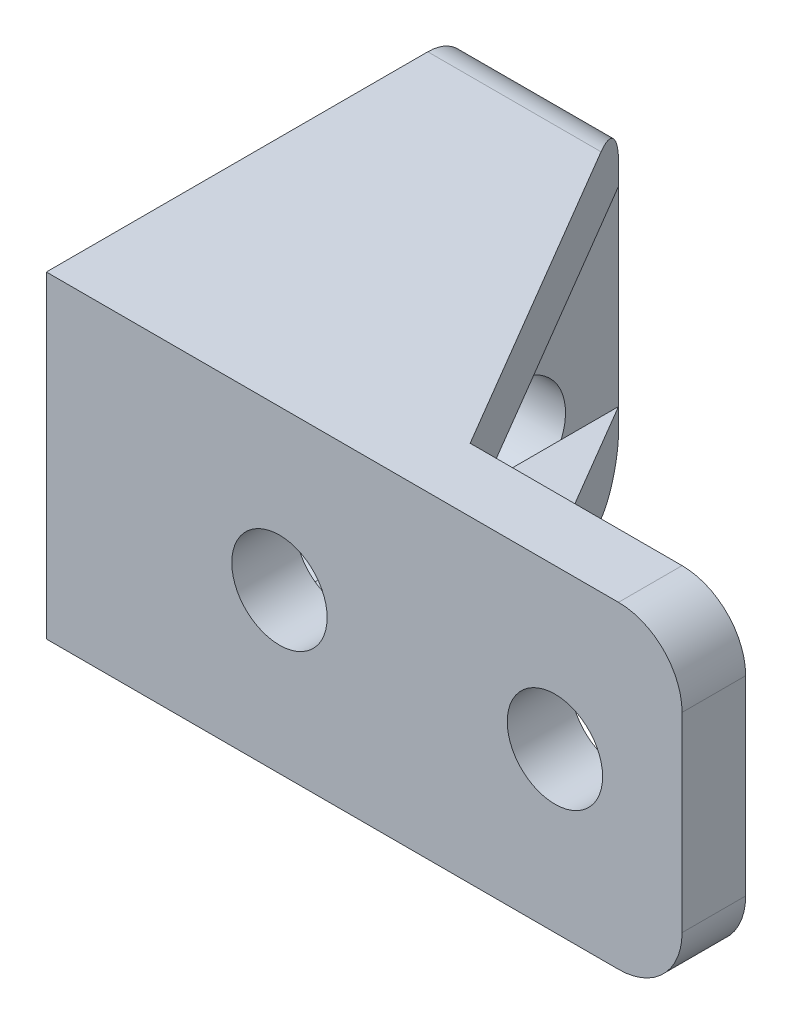
ISO-10303-21;
HEADER;
FILE_DESCRIPTION(('STEP AP214'),'2;1');
FILE_NAME('part.step','',(''),(''),'','','');
FILE_SCHEMA(('AUTOMOTIVE_DESIGN { 1 0 10303 214 1 1 1 1 }'));
ENDSEC;
DATA;
#1=APPLICATION_CONTEXT('core data for automotive mechanical design processes');
#2=APPLICATION_PROTOCOL_DEFINITION('international standard','automotive_design',2000,#1);
#3=PRODUCT_CONTEXT('',#1,'mechanical');
#4=PRODUCT('Part','Part','',(#3));
#5=PRODUCT_RELATED_PRODUCT_CATEGORY('part','',(#4));
#6=PRODUCT_DEFINITION_FORMATION('','',#4);
#7=PRODUCT_DEFINITION_CONTEXT('part definition',#1,'design');
#8=PRODUCT_DEFINITION('design','',#6,#7);
#9=PRODUCT_DEFINITION_SHAPE('','',#8);
#10=(LENGTH_UNIT() NAMED_UNIT(*) SI_UNIT(.MILLI.,.METRE.));
#11=(NAMED_UNIT(*) PLANE_ANGLE_UNIT() SI_UNIT($,.RADIAN.));
#12=(NAMED_UNIT(*) SI_UNIT($,.STERADIAN.) SOLID_ANGLE_UNIT());
#13=UNCERTAINTY_MEASURE_WITH_UNIT(LENGTH_MEASURE(1.E-05),#10,'distance_accuracy_value','');
#14=(GEOMETRIC_REPRESENTATION_CONTEXT(3) GLOBAL_UNCERTAINTY_ASSIGNED_CONTEXT((#13)) GLOBAL_UNIT_ASSIGNED_CONTEXT((#10,
#11,#12)) REPRESENTATION_CONTEXT('',''));
#15=CARTESIAN_POINT('',(0.,0.,0.));
#16=DIRECTION('',(0.,0.,1.));
#17=DIRECTION('',(1.,0.,0.));
#18=AXIS2_PLACEMENT_3D('',#15,#16,#17);
#19=CARTESIAN_POINT('',(0.,15.,-1.5));
#20=DIRECTION('',(0.,0.,1.));
#21=DIRECTION('',(1.,0.,0.));
#22=AXIS2_PLACEMENT_3D('',#19,#20,#21);
#23=PLANE('',#22);
#24=CARTESIAN_POINT('',(9.,7.5,-1.5));
#25=DIRECTION('',(0.,0.,-1.));
#26=DIRECTION('',(-1.,0.,0.));
#27=AXIS2_PLACEMENT_3D('',#24,#25,#26);
#28=CIRCLE('',#27,2.25);
#29=CARTESIAN_POINT('',(6.75,7.5,-1.5));
#30=VERTEX_POINT('',#29);
#31=EDGE_CURVE('E249',#30,#30,#28,.T.);
#32=ORIENTED_EDGE('',*,*,#31,.F.);
#33=EDGE_LOOP('',(#32));
#34=FACE_BOUND('',#33,.T.);
#35=CARTESIAN_POINT('',(-4.,7.5,-1.5));
#36=DIRECTION('',(0.,0.,-1.));
#37=DIRECTION('',(-1.,0.,0.));
#38=AXIS2_PLACEMENT_3D('',#35,#36,#37);
#39=CIRCLE('',#38,2.25);
#40=CARTESIAN_POINT('',(-6.25,7.5,-1.5));
#41=VERTEX_POINT('',#40);
#42=EDGE_CURVE('E245',#41,#41,#39,.T.);
#43=ORIENTED_EDGE('',*,*,#42,.F.);
#44=EDGE_LOOP('',(#43));
#45=FACE_BOUND('',#44,.T.);
#46=DIRECTION('',(-1.,0.,0.));
#47=VECTOR('',#46,1.);
#48=CARTESIAN_POINT('',(0.,15.,-1.5));
#49=LINE('',#48,#47);
#50=CARTESIAN_POINT('',(12.,15.,-1.5));
#51=VERTEX_POINT('',#50);
#52=CARTESIAN_POINT('',(2.,15.,-1.5));
#53=VERTEX_POINT('',#52);
#54=EDGE_CURVE('E355',#51,#53,#49,.T.);
#55=ORIENTED_EDGE('',*,*,#54,.F.);
#56=CARTESIAN_POINT('',(12.,12.,-1.5));
#57=DIRECTION('',(0.,0.,1.));
#58=DIRECTION('',(1.,0.,0.));
#59=AXIS2_PLACEMENT_3D('',#56,#57,#58);
#60=CIRCLE('',#59,3.);
#61=CARTESIAN_POINT('',(15.,12.,-1.5));
#62=VERTEX_POINT('',#61);
#63=EDGE_CURVE('E274',#51,#62,#60,.F.);
#64=ORIENTED_EDGE('',*,*,#63,.T.);
#65=DIRECTION('',(0.,-1.,0.));
#66=VECTOR('',#65,1.);
#67=CARTESIAN_POINT('',(15.,15.,-1.5));
#68=LINE('',#67,#66);
#69=CARTESIAN_POINT('',(15.,3.,-1.5));
#70=VERTEX_POINT('',#69);
#71=EDGE_CURVE('E377',#62,#70,#68,.T.);
#72=ORIENTED_EDGE('',*,*,#71,.T.);
#73=CARTESIAN_POINT('',(12.,3.,-1.5));
#74=DIRECTION('',(0.,0.,1.));
#75=DIRECTION('',(1.,0.,0.));
#76=AXIS2_PLACEMENT_3D('',#73,#74,#75);
#77=CIRCLE('',#76,3.);
#78=CARTESIAN_POINT('',(12.,0.,-1.5));
#79=VERTEX_POINT('',#78);
#80=EDGE_CURVE('E271',#70,#79,#77,.F.);
#81=ORIENTED_EDGE('',*,*,#80,.T.);
#82=DIRECTION('',(-1.,0.,0.));
#83=VECTOR('',#82,1.);
#84=CARTESIAN_POINT('',(0.,0.,-1.5));
#85=LINE('',#84,#83);
#86=CARTESIAN_POINT('',(2.00000000000001,0.,-1.5));
#87=VERTEX_POINT('',#86);
#88=EDGE_CURVE('E352',#79,#87,#85,.T.);
#89=ORIENTED_EDGE('',*,*,#88,.T.);
#90=DIRECTION('',(0.,-1.,0.));
#91=VECTOR('',#90,1.);
#92=CARTESIAN_POINT('',(2.00000000000001,3.,-1.5));
#93=LINE('',#92,#91);
#94=CARTESIAN_POINT('',(2.00000000000001,3.,-1.5));
#95=VERTEX_POINT('',#94);
#96=EDGE_CURVE('E200',#95,#87,#93,.T.);
#97=ORIENTED_EDGE('',*,*,#96,.F.);
#98=DIRECTION('',(1.,0.,0.));
#99=VECTOR('',#98,1.);
#100=CARTESIAN_POINT('',(0.,3.,-1.5));
#101=LINE('',#100,#99);
#102=CARTESIAN_POINT('',(-8.,3.,-1.5));
#103=VERTEX_POINT('',#102);
#104=EDGE_CURVE('E197',#103,#95,#101,.T.);
#105=ORIENTED_EDGE('',*,*,#104,.F.);
#106=DIRECTION('',(0.,-1.,0.));
#107=VECTOR('',#106,1.);
#108=CARTESIAN_POINT('',(-8.,15.,-1.5));
#109=LINE('',#108,#107);
#110=CARTESIAN_POINT('',(-8.,5.5,-1.5));
#111=VERTEX_POINT('',#110);
#112=EDGE_CURVE('E211',#111,#103,#109,.T.);
#113=ORIENTED_EDGE('',*,*,#112,.F.);
#114=DIRECTION('',(0.,-1.,0.));
#115=VECTOR('',#114,1.);
#116=CARTESIAN_POINT('',(-8.,15.,-1.5));
#117=LINE('',#116,#115);
#118=CARTESIAN_POINT('',(-8.,9.5,-1.5));
#119=VERTEX_POINT('',#118);
#120=EDGE_CURVE('E373',#119,#111,#117,.T.);
#121=ORIENTED_EDGE('',*,*,#120,.F.);
#122=CARTESIAN_POINT('',(-8.,12.,-1.5));
#123=VERTEX_POINT('',#122);
#124=EDGE_CURVE('E374',#123,#119,#117,.T.);
#125=ORIENTED_EDGE('',*,*,#124,.F.);
#126=DIRECTION('',(1.,0.,0.));
#127=VECTOR('',#126,1.);
#128=CARTESIAN_POINT('',(-8.,12.,-1.5));
#129=LINE('',#128,#127);
#130=CARTESIAN_POINT('',(2.,12.,-1.5));
#131=VERTEX_POINT('',#130);
#132=EDGE_CURVE('E332',#123,#131,#129,.T.);
#133=ORIENTED_EDGE('',*,*,#132,.T.);
#134=DIRECTION('',(0.,1.,0.));
#135=VECTOR('',#134,1.);
#136=CARTESIAN_POINT('',(2.,12.,-1.5));
#137=LINE('',#136,#135);
#138=EDGE_CURVE('E341',#131,#53,#137,.T.);
#139=ORIENTED_EDGE('',*,*,#138,.T.);
#140=EDGE_LOOP('',(#55,#64,#72,#81,#89,#97,#105,#113,#121,#125,#133,#139));
#141=FACE_BOUND('',#140,.T.);
#142=ADVANCED_FACE('F41',(#34,#45,#141),#23,.F.);
#143=CARTESIAN_POINT('',(-8.,15.,0.));
#144=DIRECTION('',(-1.,0.,0.));
#145=DIRECTION('',(0.,0.,1.));
#146=AXIS2_PLACEMENT_3D('',#143,#144,#145);
#147=PLANE('',#146);
#148=ORIENTED_EDGE('',*,*,#120,.T.);
#149=CARTESIAN_POINT('',(-8.,4.,-3.5));
#150=DIRECTION('',(-1.,0.,0.));
#151=DIRECTION('',(0.,0.,1.));
#152=AXIS2_PLACEMENT_3D('',#149,#150,#151);
#153=CIRCLE('',#152,2.5);
#154=CARTESIAN_POINT('',(-8.,3.,-5.79128784747792));
#155=VERTEX_POINT('',#154);
#156=EDGE_CURVE('E225',#155,#111,#153,.F.);
#157=ORIENTED_EDGE('',*,*,#156,.F.);
#158=DIRECTION('',(0.,0.,1.));
#159=VECTOR('',#158,1.);
#160=CARTESIAN_POINT('',(-8.,3.,0.));
#161=LINE('',#160,#159);
#162=CARTESIAN_POINT('',(-8.,3.,-11.2087121525221));
#163=VERTEX_POINT('',#162);
#164=EDGE_CURVE('E171',#163,#155,#161,.T.);
#165=ORIENTED_EDGE('',*,*,#164,.F.);
#166=CARTESIAN_POINT('',(-8.,4.,-13.5));
#167=DIRECTION('',(-1.,0.,0.));
#168=DIRECTION('',(0.,0.,1.));
#169=AXIS2_PLACEMENT_3D('',#166,#167,#168);
#170=CIRCLE('',#169,2.5);
#171=CARTESIAN_POINT('',(-8.,3.,-15.7912878474779));
#172=VERTEX_POINT('',#171);
#173=EDGE_CURVE('E177',#172,#163,#170,.F.);
#174=ORIENTED_EDGE('',*,*,#173,.F.);
#175=CARTESIAN_POINT('',(-8.,3.,-18.5));
#176=VERTEX_POINT('',#175);
#177=EDGE_CURVE('E170',#176,#172,#161,.T.);
#178=ORIENTED_EDGE('',*,*,#177,.F.);
#179=DIRECTION('',(0.,-1.,0.));
#180=VECTOR('',#179,1.);
#181=CARTESIAN_POINT('',(-8.,15.,-18.5));
#182=LINE('',#181,#180);
#183=CARTESIAN_POINT('',(-8.,12.,-18.5));
#184=VERTEX_POINT('',#183);
#185=EDGE_CURVE('E369',#184,#176,#182,.T.);
#186=ORIENTED_EDGE('',*,*,#185,.F.);
#187=DIRECTION('',(0.,0.,1.));
#188=VECTOR('',#187,1.);
#189=CARTESIAN_POINT('',(-8.,12.,-18.5));
#190=LINE('',#189,#188);
#191=CARTESIAN_POINT('',(-8.,12.,-15.7912878474779));
#192=VERTEX_POINT('',#191);
#193=EDGE_CURVE('E328',#184,#192,#190,.T.);
#194=ORIENTED_EDGE('',*,*,#193,.T.);
#195=CARTESIAN_POINT('',(-8.,11.,-13.5));
#196=DIRECTION('',(-1.,0.,0.));
#197=DIRECTION('',(0.,0.,1.));
#198=AXIS2_PLACEMENT_3D('',#195,#196,#197);
#199=CIRCLE('',#198,2.5);
#200=CARTESIAN_POINT('',(-8.,12.,-11.2087121525221));
#201=VERTEX_POINT('',#200);
#202=EDGE_CURVE('E241',#201,#192,#199,.F.);
#203=ORIENTED_EDGE('',*,*,#202,.F.);
#204=CARTESIAN_POINT('',(-8.,12.,-5.79128784747792));
#205=VERTEX_POINT('',#204);
#206=EDGE_CURVE('E674',#201,#205,#190,.T.);
#207=ORIENTED_EDGE('',*,*,#206,.T.);
#208=CARTESIAN_POINT('',(-8.,11.,-3.5));
#209=DIRECTION('',(-1.,0.,0.));
#210=DIRECTION('',(0.,0.,1.));
#211=AXIS2_PLACEMENT_3D('',#208,#209,#210);
#212=CIRCLE('',#211,2.5);
#213=EDGE_CURVE('E216',#119,#205,#212,.F.);
#214=ORIENTED_EDGE('',*,*,#213,.F.);
#215=EDGE_LOOP('',(#148,#157,#165,#174,#178,#186,#194,#203,#207,#214));
#216=FACE_BOUND('',#215,.T.);
#217=ADVANCED_FACE('F184',(#216),#147,.F.);
#218=CARTESIAN_POINT('',(-15.,15.,0.));
#219=DIRECTION('',(-1.,0.,0.));
#220=DIRECTION('',(0.,0.,1.));
#221=AXIS2_PLACEMENT_3D('',#218,#219,#220);
#222=PLANE('',#221);
#223=CARTESIAN_POINT('',(-15.,4.,-3.5));
#224=DIRECTION('',(-1.,0.,0.));
#225=DIRECTION('',(0.,0.,1.));
#226=AXIS2_PLACEMENT_3D('',#223,#224,#225);
#227=CIRCLE('',#226,2.5);
#228=CARTESIAN_POINT('',(-15.,4.,-0.999999999999997));
#229=VERTEX_POINT('',#228);
#230=EDGE_CURVE('E230',#229,#229,#227,.T.);
#231=ORIENTED_EDGE('',*,*,#230,.F.);
#232=EDGE_LOOP('',(#231));
#233=FACE_BOUND('',#232,.T.);
#234=CARTESIAN_POINT('',(-15.,4.,-13.5));
#235=DIRECTION('',(-1.,0.,0.));
#236=DIRECTION('',(0.,0.,1.));
#237=AXIS2_PLACEMENT_3D('',#234,#235,#236);
#238=CIRCLE('',#237,2.5);
#239=CARTESIAN_POINT('',(-15.,4.,-11.));
#240=VERTEX_POINT('',#239);
#241=EDGE_CURVE('E189',#240,#240,#238,.T.);
#242=ORIENTED_EDGE('',*,*,#241,.F.);
#243=EDGE_LOOP('',(#242));
#244=FACE_BOUND('',#243,.T.);
#245=CARTESIAN_POINT('',(-15.,11.,-13.5));
#246=DIRECTION('',(-1.,0.,0.));
#247=DIRECTION('',(0.,0.,1.));
#248=AXIS2_PLACEMENT_3D('',#245,#246,#247);
#249=CIRCLE('',#248,2.5);
#250=CARTESIAN_POINT('',(-15.,11.,-11.));
#251=VERTEX_POINT('',#250);
#252=EDGE_CURVE('E180',#251,#251,#249,.T.);
#253=ORIENTED_EDGE('',*,*,#252,.F.);
#254=EDGE_LOOP('',(#253));
#255=FACE_BOUND('',#254,.T.);
#256=CARTESIAN_POINT('',(-15.,11.,-3.5));
#257=DIRECTION('',(-1.,0.,0.));
#258=DIRECTION('',(0.,0.,1.));
#259=AXIS2_PLACEMENT_3D('',#256,#257,#258);
#260=CIRCLE('',#259,2.5);
#261=CARTESIAN_POINT('',(-15.,11.,-0.999999999999997));
#262=VERTEX_POINT('',#261);
#263=EDGE_CURVE('E220',#262,#262,#260,.T.);
#264=ORIENTED_EDGE('',*,*,#263,.F.);
#265=EDGE_LOOP('',(#264));
#266=FACE_BOUND('',#265,.T.);
#267=DIRECTION('',(0.,0.,-1.));
#268=VECTOR('',#267,1.);
#269=CARTESIAN_POINT('',(-15.,15.,0.));
#270=LINE('',#269,#268);
#271=CARTESIAN_POINT('',(-15.,15.,1.5));
#272=VERTEX_POINT('',#271);
#273=CARTESIAN_POINT('',(-15.,15.,-16.5));
#274=VERTEX_POINT('',#273);
#275=EDGE_CURVE('E347',#272,#274,#270,.T.);
#276=ORIENTED_EDGE('',*,*,#275,.T.);
#277=CARTESIAN_POINT('',(-15.,13.,-16.5));
#278=DIRECTION('',(-1.,0.,0.));
#279=DIRECTION('',(0.,0.,1.));
#280=AXIS2_PLACEMENT_3D('',#277,#278,#279);
#281=CIRCLE('',#280,2.);
#282=CARTESIAN_POINT('',(-15.,13.,-18.5));
#283=VERTEX_POINT('',#282);
#284=EDGE_CURVE('E308',#274,#283,#281,.T.);
#285=ORIENTED_EDGE('',*,*,#284,.T.);
#286=DIRECTION('',(0.,-1.,0.));
#287=VECTOR('',#286,1.);
#288=CARTESIAN_POINT('',(-15.,15.,-18.5));
#289=LINE('',#288,#287);
#290=CARTESIAN_POINT('',(-15.,2.,-18.5));
#291=VERTEX_POINT('',#290);
#292=EDGE_CURVE('E359',#283,#291,#289,.T.);
#293=ORIENTED_EDGE('',*,*,#292,.T.);
#294=CARTESIAN_POINT('',(-15.,2.,-16.5));
#295=DIRECTION('',(-1.,0.,0.));
#296=DIRECTION('',(0.,0.,1.));
#297=AXIS2_PLACEMENT_3D('',#294,#295,#296);
#298=CIRCLE('',#297,2.);
#299=CARTESIAN_POINT('',(-15.,0.,-16.5));
#300=VERTEX_POINT('',#299);
#301=EDGE_CURVE('E63',#291,#300,#298,.T.);
#302=ORIENTED_EDGE('',*,*,#301,.T.);
#303=DIRECTION('',(0.,0.,-1.));
#304=VECTOR('',#303,1.);
#305=CARTESIAN_POINT('',(-15.,0.,0.));
#306=LINE('',#305,#304);
#307=CARTESIAN_POINT('',(-15.,0.,1.5));
#308=VERTEX_POINT('',#307);
#309=EDGE_CURVE('E315',#308,#300,#306,.T.);
#310=ORIENTED_EDGE('',*,*,#309,.F.);
#311=DIRECTION('',(0.,-1.,0.));
#312=VECTOR('',#311,1.);
#313=CARTESIAN_POINT('',(-15.,15.,1.5));
#314=LINE('',#313,#312);
#315=EDGE_CURVE('E264',#272,#308,#314,.T.);
#316=ORIENTED_EDGE('',*,*,#315,.F.);
#317=EDGE_LOOP('',(#276,#285,#293,#302,#310,#316));
#318=FACE_BOUND('',#317,.T.);
#319=ADVANCED_FACE('F395',(#233,#244,#255,#266,#318),#222,.T.);
#320=CARTESIAN_POINT('',(0.,15.,1.5));
#321=DIRECTION('',(0.,0.,1.));
#322=DIRECTION('',(1.,0.,0.));
#323=AXIS2_PLACEMENT_3D('',#320,#321,#322);
#324=PLANE('',#323);
#325=CARTESIAN_POINT('',(9.,7.5,1.5));
#326=DIRECTION('',(0.,0.,1.));
#327=DIRECTION('',(1.,0.,0.));
#328=AXIS2_PLACEMENT_3D('',#325,#326,#327);
#329=CIRCLE('',#328,2.25);
#330=CARTESIAN_POINT('',(11.25,7.5,1.5));
#331=VERTEX_POINT('',#330);
#332=EDGE_CURVE('E233',#331,#331,#329,.T.);
#333=ORIENTED_EDGE('',*,*,#332,.F.);
#334=EDGE_LOOP('',(#333));
#335=FACE_BOUND('',#334,.T.);
#336=CARTESIAN_POINT('',(-4.,7.5,1.5));
#337=DIRECTION('',(0.,0.,1.));
#338=DIRECTION('',(1.,0.,0.));
#339=AXIS2_PLACEMENT_3D('',#336,#337,#338);
#340=CIRCLE('',#339,2.25);
#341=CARTESIAN_POINT('',(-1.75,7.5,1.5));
#342=VERTEX_POINT('',#341);
#343=EDGE_CURVE('E252',#342,#342,#340,.T.);
#344=ORIENTED_EDGE('',*,*,#343,.F.);
#345=EDGE_LOOP('',(#344));
#346=FACE_BOUND('',#345,.T.);
#347=DIRECTION('',(0.,-1.,0.));
#348=VECTOR('',#347,1.);
#349=CARTESIAN_POINT('',(15.,15.,1.5));
#350=LINE('',#349,#348);
#351=CARTESIAN_POINT('',(15.,12.,1.5));
#352=VERTEX_POINT('',#351);
#353=CARTESIAN_POINT('',(15.,3.,1.5));
#354=VERTEX_POINT('',#353);
#355=EDGE_CURVE('E380',#352,#354,#350,.T.);
#356=ORIENTED_EDGE('',*,*,#355,.F.);
#357=CARTESIAN_POINT('',(12.,12.,1.5));
#358=DIRECTION('',(0.,0.,1.));
#359=DIRECTION('',(1.,0.,0.));
#360=AXIS2_PLACEMENT_3D('',#357,#358,#359);
#361=CIRCLE('',#360,3.);
#362=CARTESIAN_POINT('',(12.,15.,1.5));
#363=VERTEX_POINT('',#362);
#364=EDGE_CURVE('E287',#352,#363,#361,.T.);
#365=ORIENTED_EDGE('',*,*,#364,.T.);
#366=DIRECTION('',(-1.,0.,0.));
#367=VECTOR('',#366,1.);
#368=CARTESIAN_POINT('',(0.,15.,1.5));
#369=LINE('',#368,#367);
#370=EDGE_CURVE('E351',#363,#272,#369,.T.);
#371=ORIENTED_EDGE('',*,*,#370,.T.);
#372=ORIENTED_EDGE('',*,*,#315,.T.);
#373=DIRECTION('',(-1.,0.,0.));
#374=VECTOR('',#373,1.);
#375=CARTESIAN_POINT('',(0.,0.,1.5));
#376=LINE('',#375,#374);
#377=CARTESIAN_POINT('',(12.,0.,1.5));
#378=VERTEX_POINT('',#377);
#379=EDGE_CURVE('E362',#378,#308,#376,.T.);
#380=ORIENTED_EDGE('',*,*,#379,.F.);
#381=CARTESIAN_POINT('',(12.,3.,1.5));
#382=DIRECTION('',(0.,0.,1.));
#383=DIRECTION('',(1.,0.,0.));
#384=AXIS2_PLACEMENT_3D('',#381,#382,#383);
#385=CIRCLE('',#384,3.);
#386=EDGE_CURVE('E284',#378,#354,#385,.T.);
#387=ORIENTED_EDGE('',*,*,#386,.T.);
#388=EDGE_LOOP('',(#356,#365,#371,#372,#380,#387));
#389=FACE_BOUND('',#388,.T.);
#390=ADVANCED_FACE('F391',(#335,#346,#389),#324,.T.);
#391=CARTESIAN_POINT('',(15.,15.,0.));
#392=DIRECTION('',(-1.,0.,0.));
#393=DIRECTION('',(0.,0.,1.));
#394=AXIS2_PLACEMENT_3D('',#391,#392,#393);
#395=PLANE('',#394);
#396=ORIENTED_EDGE('',*,*,#71,.F.);
#397=DIRECTION('',(0.,0.,-1.));
#398=VECTOR('',#397,1.);
#399=CARTESIAN_POINT('',(15.,12.,1.5));
#400=LINE('',#399,#398);
#401=EDGE_CURVE('E281',#62,#352,#400,.F.);
#402=ORIENTED_EDGE('',*,*,#401,.T.);
#403=ORIENTED_EDGE('',*,*,#355,.T.);
#404=DIRECTION('',(0.,0.,-1.));
#405=VECTOR('',#404,1.);
#406=CARTESIAN_POINT('',(15.,3.,0.));
#407=LINE('',#406,#405);
#408=EDGE_CURVE('E277',#354,#70,#407,.T.);
#409=ORIENTED_EDGE('',*,*,#408,.T.);
#410=EDGE_LOOP('',(#396,#402,#403,#409));
#411=FACE_BOUND('',#410,.T.);
#412=ADVANCED_FACE('F404',(#411),#395,.F.);
#413=CARTESIAN_POINT('',(0.,15.,-18.5));
#414=DIRECTION('',(0.,0.,-1.));
#415=DIRECTION('',(-1.,0.,0.));
#416=AXIS2_PLACEMENT_3D('',#413,#414,#415);
#417=PLANE('',#416);
#418=ORIENTED_EDGE('',*,*,#292,.F.);
#419=DIRECTION('',(1.,0.,0.));
#420=VECTOR('',#419,1.);
#421=CARTESIAN_POINT('',(0.,13.,-18.5));
#422=LINE('',#421,#420);
#423=CARTESIAN_POINT('',(-8.,13.,-18.5));
#424=VERTEX_POINT('',#423);
#425=EDGE_CURVE('E296',#283,#424,#422,.T.);
#426=ORIENTED_EDGE('',*,*,#425,.T.);
#427=EDGE_CURVE('E370',#424,#184,#182,.T.);
#428=ORIENTED_EDGE('',*,*,#427,.T.);
#429=ORIENTED_EDGE('',*,*,#185,.T.);
#430=DIRECTION('',(0.,-1.,0.));
#431=VECTOR('',#430,1.);
#432=CARTESIAN_POINT('',(-8.,3.,-18.5));
#433=LINE('',#432,#431);
#434=CARTESIAN_POINT('',(-8.,2.,-18.5));
#435=VERTEX_POINT('',#434);
#436=EDGE_CURVE('E322',#176,#435,#433,.T.);
#437=ORIENTED_EDGE('',*,*,#436,.T.);
#438=DIRECTION('',(1.,0.,0.));
#439=VECTOR('',#438,1.);
#440=CARTESIAN_POINT('',(-15.,2.,-18.5));
#441=LINE('',#440,#439);
#442=EDGE_CURVE('E293',#435,#291,#441,.F.);
#443=ORIENTED_EDGE('',*,*,#442,.T.);
#444=EDGE_LOOP('',(#418,#426,#428,#429,#437,#443));
#445=FACE_BOUND('',#444,.T.);
#446=ADVANCED_FACE('F420',(#445),#417,.T.);
#447=CARTESIAN_POINT('',(0.,15.,0.));
#448=DIRECTION('',(0.,1.,0.));
#449=DIRECTION('',(0.,0.,1.));
#450=AXIS2_PLACEMENT_3D('',#447,#448,#449);
#451=PLANE('',#450);
#452=DIRECTION('',(0.507020126563394,0.,0.861934215157769));
#453=VECTOR('',#452,1.);
#454=CARTESIAN_POINT('',(-8.,15.,-18.5));
#455=LINE('',#454,#453);
#456=CARTESIAN_POINT('',(-6.8235294117647,15.,-16.5));
#457=VERTEX_POINT('',#456);
#458=EDGE_CURVE('E325',#457,#53,#455,.T.);
#459=ORIENTED_EDGE('',*,*,#458,.F.);
#460=DIRECTION('',(1.,0.,0.));
#461=VECTOR('',#460,1.);
#462=CARTESIAN_POINT('',(0.,15.,-16.5));
#463=LINE('',#462,#461);
#464=EDGE_CURVE('E303',#457,#274,#463,.F.);
#465=ORIENTED_EDGE('',*,*,#464,.T.);
#466=ORIENTED_EDGE('',*,*,#275,.F.);
#467=ORIENTED_EDGE('',*,*,#370,.F.);
#468=DIRECTION('',(0.,0.,-1.));
#469=VECTOR('',#468,1.);
#470=CARTESIAN_POINT('',(12.,15.,-1.5));
#471=LINE('',#470,#469);
#472=EDGE_CURVE('E267',#363,#51,#471,.T.);
#473=ORIENTED_EDGE('',*,*,#472,.T.);
#474=ORIENTED_EDGE('',*,*,#54,.T.);
#475=EDGE_LOOP('',(#459,#465,#466,#467,#473,#474));
#476=FACE_BOUND('',#475,.T.);
#477=ADVANCED_FACE('F424',(#476),#451,.T.);
#478=CARTESIAN_POINT('',(0.,0.,0.));
#479=DIRECTION('',(0.,1.,0.));
#480=DIRECTION('',(0.,0.,1.));
#481=AXIS2_PLACEMENT_3D('',#478,#479,#480);
#482=PLANE('',#481);
#483=ORIENTED_EDGE('',*,*,#309,.T.);
#484=DIRECTION('',(1.,0.,0.));
#485=VECTOR('',#484,1.);
#486=CARTESIAN_POINT('',(-8.,0.,-16.5));
#487=LINE('',#486,#485);
#488=CARTESIAN_POINT('',(-6.8235294117647,0.,-16.5));
#489=VERTEX_POINT('',#488);
#490=EDGE_CURVE('E50',#300,#489,#487,.T.);
#491=ORIENTED_EDGE('',*,*,#490,.T.);
#492=DIRECTION('',(-0.507020126563394,0.,-0.86193421515777));
#493=VECTOR('',#492,1.);
#494=CARTESIAN_POINT('',(2.1413881748072,0.,-1.25964010282777));
#495=LINE('',#494,#493);
#496=EDGE_CURVE('E208',#87,#489,#495,.T.);
#497=ORIENTED_EDGE('',*,*,#496,.F.);
#498=ORIENTED_EDGE('',*,*,#88,.F.);
#499=DIRECTION('',(0.,0.,-1.));
#500=VECTOR('',#499,1.);
#501=CARTESIAN_POINT('',(12.,0.,0.));
#502=LINE('',#501,#500);
#503=EDGE_CURVE('E290',#79,#378,#502,.F.);
#504=ORIENTED_EDGE('',*,*,#503,.T.);
#505=ORIENTED_EDGE('',*,*,#379,.T.);
#506=EDGE_LOOP('',(#483,#491,#497,#498,#504,#505));
#507=FACE_BOUND('',#506,.T.);
#508=ADVANCED_FACE('F313',(#507),#482,.F.);
#509=CARTESIAN_POINT('',(-8.,12.,-18.5));
#510=DIRECTION('',(-0.861934215157769,0.,0.507020126563394));
#511=DIRECTION('',(0.507020126563394,0.,0.86193421515777));
#512=AXIS2_PLACEMENT_3D('',#509,#510,#511);
#513=PLANE('',#512);
#514=ORIENTED_EDGE('',*,*,#427,.F.);
#515=CARTESIAN_POINT('',(-6.8235294117647,13.,-16.5));
#516=DIRECTION('',(-0.861934215157769,0.,0.507020126563394));
#517=DIRECTION('',(0.507020126563394,0.,0.86193421515777));
#518=AXIS2_PLACEMENT_3D('',#515,#516,#517);
#519=ELLIPSE('',#518,2.32036269686071,2.);
#520=EDGE_CURVE('E300',#424,#457,#519,.F.);
#521=ORIENTED_EDGE('',*,*,#520,.T.);
#522=ORIENTED_EDGE('',*,*,#458,.T.);
#523=ORIENTED_EDGE('',*,*,#138,.F.);
#524=DIRECTION('',(0.507020126563394,0.,0.861934215157769));
#525=VECTOR('',#524,1.);
#526=CARTESIAN_POINT('',(-8.,12.,-18.5));
#527=LINE('',#526,#525);
#528=EDGE_CURVE('E338',#184,#131,#527,.T.);
#529=ORIENTED_EDGE('',*,*,#528,.F.);
#530=EDGE_LOOP('',(#514,#521,#522,#523,#529));
#531=FACE_BOUND('',#530,.T.);
#532=ADVANCED_FACE('F499',(#531),#513,.F.);
#533=CARTESIAN_POINT('',(0.,12.,0.));
#534=DIRECTION('',(0.,1.,0.));
#535=DIRECTION('',(0.,0.,1.));
#536=AXIS2_PLACEMENT_3D('',#533,#534,#535);
#537=PLANE('',#536);
#538=ORIENTED_EDGE('',*,*,#193,.F.);
#539=ORIENTED_EDGE('',*,*,#528,.T.);
#540=ORIENTED_EDGE('',*,*,#132,.F.);
#541=EDGE_CURVE('E334',#205,#123,#190,.T.);
#542=ORIENTED_EDGE('',*,*,#541,.F.);
#543=ORIENTED_EDGE('',*,*,#206,.F.);
#544=EDGE_CURVE('E333',#192,#201,#190,.T.);
#545=ORIENTED_EDGE('',*,*,#544,.F.);
#546=EDGE_LOOP('',(#538,#539,#540,#542,#543,#545));
#547=FACE_BOUND('',#546,.T.);
#548=ADVANCED_FACE('F496',(#547),#537,.F.);
#549=CARTESIAN_POINT('',(2.1413881748072,3.,-1.25964010282777));
#550=DIRECTION('',(-0.861934215157769,0.,0.507020126563394));
#551=DIRECTION('',(0.507020126563394,0.,0.86193421515777));
#552=AXIS2_PLACEMENT_3D('',#549,#550,#551);
#553=PLANE('',#552);
#554=ORIENTED_EDGE('',*,*,#496,.T.);
#555=CARTESIAN_POINT('',(-6.8235294117647,2.,-16.5));
#556=DIRECTION('',(-0.861934215157769,0.,0.507020126563394));
#557=DIRECTION('',(-0.507020126563394,0.,-0.86193421515777));
#558=AXIS2_PLACEMENT_3D('',#555,#556,#557);
#559=ELLIPSE('',#558,2.32036269686071,2.);
#560=EDGE_CURVE('E11',#489,#435,#559,.F.);
#561=ORIENTED_EDGE('',*,*,#560,.T.);
#562=ORIENTED_EDGE('',*,*,#436,.F.);
#563=DIRECTION('',(-0.507020126563394,0.,-0.86193421515777));
#564=VECTOR('',#563,1.);
#565=CARTESIAN_POINT('',(2.1413881748072,3.,-1.25964010282777));
#566=LINE('',#565,#564);
#567=EDGE_CURVE('E194',#95,#176,#566,.T.);
#568=ORIENTED_EDGE('',*,*,#567,.F.);
#569=ORIENTED_EDGE('',*,*,#96,.T.);
#570=EDGE_LOOP('',(#554,#561,#562,#568,#569));
#571=FACE_BOUND('',#570,.T.);
#572=ADVANCED_FACE('F318',(#571),#553,.F.);
#573=CARTESIAN_POINT('',(0.,3.,0.));
#574=DIRECTION('',(0.,-1.,0.));
#575=DIRECTION('',(0.,0.,-1.));
#576=AXIS2_PLACEMENT_3D('',#573,#574,#575);
#577=PLANE('',#576);
#578=ORIENTED_EDGE('',*,*,#567,.T.);
#579=ORIENTED_EDGE('',*,*,#177,.T.);
#580=EDGE_CURVE('E161',#172,#163,#161,.T.);
#581=ORIENTED_EDGE('',*,*,#580,.T.);
#582=ORIENTED_EDGE('',*,*,#164,.T.);
#583=EDGE_CURVE('E198',#155,#103,#161,.T.);
#584=ORIENTED_EDGE('',*,*,#583,.T.);
#585=ORIENTED_EDGE('',*,*,#104,.T.);
#586=EDGE_LOOP('',(#578,#579,#581,#582,#584,#585));
#587=FACE_BOUND('',#586,.T.);
#588=ADVANCED_FACE('F191',(#587),#577,.F.);
#589=CARTESIAN_POINT('',(-8.,15.,0.));
#590=DIRECTION('',(-1.,0.,0.));
#591=DIRECTION('',(0.,0.,1.));
#592=AXIS2_PLACEMENT_3D('',#589,#590,#591);
#593=PLANE('',#592);
#594=ORIENTED_EDGE('',*,*,#580,.F.);
#595=EDGE_CURVE('E164',#163,#172,#170,.F.);
#596=ORIENTED_EDGE('',*,*,#595,.F.);
#597=EDGE_LOOP('',(#594,#596));
#598=FACE_BOUND('',#597,.T.);
#599=ADVANCED_FACE('F163',(#598),#593,.T.);
#600=CARTESIAN_POINT('',(-0.928932188134515,4.,-13.5));
#601=DIRECTION('',(-1.,0.,0.));
#602=DIRECTION('',(0.,0.,1.));
#603=AXIS2_PLACEMENT_3D('',#600,#601,#602);
#604=CYLINDRICAL_SURFACE('',#603,2.5);
#605=ORIENTED_EDGE('',*,*,#595,.T.);
#606=ORIENTED_EDGE('',*,*,#173,.T.);
#607=EDGE_LOOP('',(#605,#606));
#608=FACE_BOUND('',#607,.T.);
#609=ORIENTED_EDGE('',*,*,#241,.T.);
#610=EDGE_LOOP('',(#609));
#611=FACE_BOUND('',#610,.T.);
#612=ADVANCED_FACE('F175',(#608,#611),#604,.F.);
#613=CARTESIAN_POINT('',(-8.,15.,0.));
#614=DIRECTION('',(-1.,0.,0.));
#615=DIRECTION('',(0.,0.,1.));
#616=AXIS2_PLACEMENT_3D('',#613,#614,#615);
#617=PLANE('',#616);
#618=ORIENTED_EDGE('',*,*,#112,.T.);
#619=ORIENTED_EDGE('',*,*,#583,.F.);
#620=EDGE_CURVE('E229',#111,#155,#153,.F.);
#621=ORIENTED_EDGE('',*,*,#620,.F.);
#622=EDGE_LOOP('',(#618,#619,#621));
#623=FACE_BOUND('',#622,.T.);
#624=ADVANCED_FACE('F477',(#623),#617,.T.);
#625=CARTESIAN_POINT('',(-0.928932188134515,4.,-3.5));
#626=DIRECTION('',(-1.,0.,0.));
#627=DIRECTION('',(0.,0.,1.));
#628=AXIS2_PLACEMENT_3D('',#625,#626,#627);
#629=CYLINDRICAL_SURFACE('',#628,2.5);
#630=ORIENTED_EDGE('',*,*,#156,.T.);
#631=ORIENTED_EDGE('',*,*,#620,.T.);
#632=EDGE_LOOP('',(#630,#631));
#633=FACE_BOUND('',#632,.T.);
#634=ORIENTED_EDGE('',*,*,#230,.T.);
#635=EDGE_LOOP('',(#634));
#636=FACE_BOUND('',#635,.T.);
#637=ADVANCED_FACE('F480',(#633,#636),#629,.F.);
#638=CARTESIAN_POINT('',(-8.,15.,0.));
#639=DIRECTION('',(-1.,0.,0.));
#640=DIRECTION('',(0.,0.,1.));
#641=AXIS2_PLACEMENT_3D('',#638,#639,#640);
#642=PLANE('',#641);
#643=ORIENTED_EDGE('',*,*,#124,.T.);
#644=EDGE_CURVE('E219',#205,#119,#212,.F.);
#645=ORIENTED_EDGE('',*,*,#644,.F.);
#646=ORIENTED_EDGE('',*,*,#541,.T.);
#647=EDGE_LOOP('',(#643,#645,#646));
#648=FACE_BOUND('',#647,.T.);
#649=ADVANCED_FACE('F484',(#648),#642,.T.);
#650=CARTESIAN_POINT('',(-0.928932188134515,11.,-3.5));
#651=DIRECTION('',(-1.,0.,0.));
#652=DIRECTION('',(0.,0.,1.));
#653=AXIS2_PLACEMENT_3D('',#650,#651,#652);
#654=CYLINDRICAL_SURFACE('',#653,2.5);
#655=ORIENTED_EDGE('',*,*,#213,.T.);
#656=ORIENTED_EDGE('',*,*,#644,.T.);
#657=EDGE_LOOP('',(#655,#656));
#658=FACE_BOUND('',#657,.T.);
#659=ORIENTED_EDGE('',*,*,#263,.T.);
#660=EDGE_LOOP('',(#659));
#661=FACE_BOUND('',#660,.T.);
#662=ADVANCED_FACE('F468',(#658,#661),#654,.F.);
#663=CARTESIAN_POINT('',(-8.,15.,0.));
#664=DIRECTION('',(-1.,0.,0.));
#665=DIRECTION('',(0.,0.,1.));
#666=AXIS2_PLACEMENT_3D('',#663,#664,#665);
#667=PLANE('',#666);
#668=ORIENTED_EDGE('',*,*,#544,.T.);
#669=EDGE_CURVE('E224',#192,#201,#199,.F.);
#670=ORIENTED_EDGE('',*,*,#669,.F.);
#671=EDGE_LOOP('',(#668,#670));
#672=FACE_BOUND('',#671,.T.);
#673=ADVANCED_FACE('F465',(#672),#667,.T.);
#674=CARTESIAN_POINT('',(-0.928932188134515,11.,-13.5));
#675=DIRECTION('',(-1.,0.,0.));
#676=DIRECTION('',(0.,0.,1.));
#677=AXIS2_PLACEMENT_3D('',#674,#675,#676);
#678=CYLINDRICAL_SURFACE('',#677,2.5);
#679=ORIENTED_EDGE('',*,*,#669,.T.);
#680=ORIENTED_EDGE('',*,*,#202,.T.);
#681=EDGE_LOOP('',(#679,#680));
#682=FACE_BOUND('',#681,.T.);
#683=ORIENTED_EDGE('',*,*,#252,.T.);
#684=EDGE_LOOP('',(#683));
#685=FACE_BOUND('',#684,.T.);
#686=ADVANCED_FACE('F462',(#682,#685),#678,.F.);
#687=CARTESIAN_POINT('',(-4.,7.5,5.5));
#688=DIRECTION('',(0.,0.,-1.));
#689=DIRECTION('',(-1.,0.,0.));
#690=AXIS2_PLACEMENT_3D('',#687,#688,#689);
#691=CYLINDRICAL_SURFACE('',#690,2.25);
#692=ORIENTED_EDGE('',*,*,#343,.T.);
#693=EDGE_LOOP('',(#692));
#694=FACE_BOUND('',#693,.T.);
#695=ORIENTED_EDGE('',*,*,#42,.T.);
#696=EDGE_LOOP('',(#695));
#697=FACE_BOUND('',#696,.T.);
#698=ADVANCED_FACE('F456',(#694,#697),#691,.F.);
#699=CARTESIAN_POINT('',(9.,7.5,5.5));
#700=DIRECTION('',(0.,0.,-1.));
#701=DIRECTION('',(-1.,0.,0.));
#702=AXIS2_PLACEMENT_3D('',#699,#700,#701);
#703=CYLINDRICAL_SURFACE('',#702,2.25);
#704=ORIENTED_EDGE('',*,*,#332,.T.);
#705=EDGE_LOOP('',(#704));
#706=FACE_BOUND('',#705,.T.);
#707=ORIENTED_EDGE('',*,*,#31,.T.);
#708=EDGE_LOOP('',(#707));
#709=FACE_BOUND('',#708,.T.);
#710=ADVANCED_FACE('F452',(#706,#709),#703,.F.);
#711=CARTESIAN_POINT('',(12.,12.,0.));
#712=DIRECTION('',(0.,0.,1.));
#713=DIRECTION('',(1.,0.,0.));
#714=AXIS2_PLACEMENT_3D('',#711,#712,#713);
#715=CYLINDRICAL_SURFACE('',#714,3.);
#716=ORIENTED_EDGE('',*,*,#364,.F.);
#717=ORIENTED_EDGE('',*,*,#401,.F.);
#718=ORIENTED_EDGE('',*,*,#63,.F.);
#719=ORIENTED_EDGE('',*,*,#472,.F.);
#720=EDGE_LOOP('',(#716,#717,#718,#719));
#721=FACE_BOUND('',#720,.T.);
#722=ADVANCED_FACE('F430',(#721),#715,.T.);
#723=CARTESIAN_POINT('',(12.,3.,0.));
#724=DIRECTION('',(0.,0.,-1.));
#725=DIRECTION('',(-1.,0.,0.));
#726=AXIS2_PLACEMENT_3D('',#723,#724,#725);
#727=CYLINDRICAL_SURFACE('',#726,3.);
#728=ORIENTED_EDGE('',*,*,#386,.F.);
#729=ORIENTED_EDGE('',*,*,#503,.F.);
#730=ORIENTED_EDGE('',*,*,#80,.F.);
#731=ORIENTED_EDGE('',*,*,#408,.F.);
#732=EDGE_LOOP('',(#728,#729,#730,#731));
#733=FACE_BOUND('',#732,.T.);
#734=ADVANCED_FACE('F445',(#733),#727,.T.);
#735=CARTESIAN_POINT('',(0.,13.,-16.5));
#736=DIRECTION('',(1.,0.,0.));
#737=DIRECTION('',(0.,0.,-1.));
#738=AXIS2_PLACEMENT_3D('',#735,#736,#737);
#739=CYLINDRICAL_SURFACE('',#738,2.);
#740=ORIENTED_EDGE('',*,*,#284,.F.);
#741=ORIENTED_EDGE('',*,*,#464,.F.);
#742=ORIENTED_EDGE('',*,*,#520,.F.);
#743=ORIENTED_EDGE('',*,*,#425,.F.);
#744=EDGE_LOOP('',(#740,#741,#742,#743));
#745=FACE_BOUND('',#744,.T.);
#746=ADVANCED_FACE('F437',(#745),#739,.T.);
#747=CARTESIAN_POINT('',(0.,2.,-16.5));
#748=DIRECTION('',(-1.,0.,0.));
#749=DIRECTION('',(0.,0.,1.));
#750=AXIS2_PLACEMENT_3D('',#747,#748,#749);
#751=CYLINDRICAL_SURFACE('',#750,2.);
#752=ORIENTED_EDGE('',*,*,#301,.F.);
#753=ORIENTED_EDGE('',*,*,#442,.F.);
#754=ORIENTED_EDGE('',*,*,#560,.F.);
#755=ORIENTED_EDGE('',*,*,#490,.F.);
#756=EDGE_LOOP('',(#752,#753,#754,#755));
#757=FACE_BOUND('',#756,.T.);
#758=ADVANCED_FACE('F43',(#757),#751,.T.);
#759=CLOSED_SHELL('',(#142,#217,#319,#390,#412,#446,#477,#508,#532,#548,#572,#588,#599,#612,
#624,#637,#649,#662,#673,#686,#698,#710,#722,#734,#746,#758));
#760=MANIFOLD_SOLID_BREP('B2',#759);
#761=ADVANCED_BREP_SHAPE_REPRESENTATION('',(#18,#760),#14);
#762=SHAPE_DEFINITION_REPRESENTATION(#9,#761);
ENDSEC;
END-ISO-10303-21;
